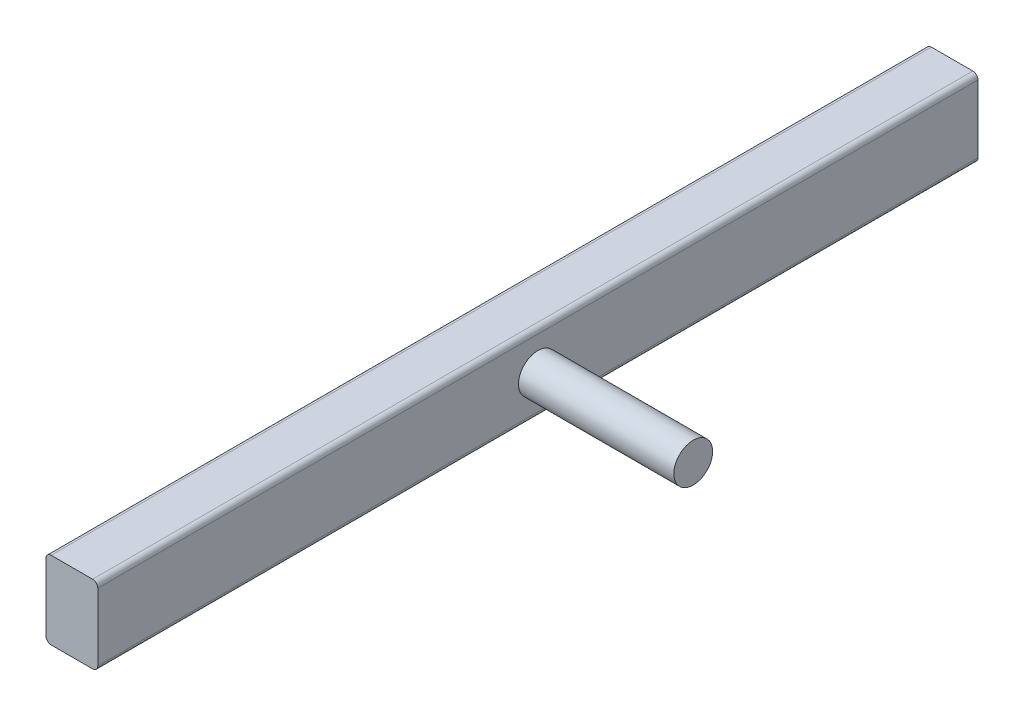
ISO-10303-21;
HEADER;
FILE_DESCRIPTION(('STEP AP214'),'2;1');
FILE_NAME('part.step','',(''),(''),'','','');
FILE_SCHEMA(('AUTOMOTIVE_DESIGN { 1 0 10303 214 1 1 1 1 }'));
ENDSEC;
DATA;
#1=APPLICATION_CONTEXT('core data for automotive mechanical design processes');
#2=APPLICATION_PROTOCOL_DEFINITION('international standard','automotive_design',2000,#1);
#3=PRODUCT_CONTEXT('',#1,'mechanical');
#4=PRODUCT('Part','Part','',(#3));
#5=PRODUCT_RELATED_PRODUCT_CATEGORY('part','',(#4));
#6=PRODUCT_DEFINITION_FORMATION('','',#4);
#7=PRODUCT_DEFINITION_CONTEXT('part definition',#1,'design');
#8=PRODUCT_DEFINITION('design','',#6,#7);
#9=PRODUCT_DEFINITION_SHAPE('','',#8);
#10=(LENGTH_UNIT() NAMED_UNIT(*) SI_UNIT(.MILLI.,.METRE.));
#11=(NAMED_UNIT(*) PLANE_ANGLE_UNIT() SI_UNIT($,.RADIAN.));
#12=(NAMED_UNIT(*) SI_UNIT($,.STERADIAN.) SOLID_ANGLE_UNIT());
#13=UNCERTAINTY_MEASURE_WITH_UNIT(LENGTH_MEASURE(1.E-05),#10,'distance_accuracy_value','');
#14=(GEOMETRIC_REPRESENTATION_CONTEXT(3) GLOBAL_UNCERTAINTY_ASSIGNED_CONTEXT((#13)) GLOBAL_UNIT_ASSIGNED_CONTEXT((#10,
#11,#12)) REPRESENTATION_CONTEXT('',''));
#15=CARTESIAN_POINT('',(0.,0.,0.));
#16=DIRECTION('',(0.,0.,1.));
#17=DIRECTION('',(1.,0.,0.));
#18=AXIS2_PLACEMENT_3D('',#15,#16,#17);
#19=CARTESIAN_POINT('',(5.,7.5,85.));
#20=DIRECTION('',(-1.,0.,0.));
#21=DIRECTION('',(0.,-1.,0.));
#22=AXIS2_PLACEMENT_3D('',#19,#20,#21);
#23=PLANE('',#22);
#24=DIRECTION('',(0.,1.,0.));
#25=VECTOR('',#24,1.);
#26=CARTESIAN_POINT('',(5.,7.5,85.));
#27=LINE('',#26,#25);
#28=CARTESIAN_POINT('',(5.,-6.5,85.));
#29=VERTEX_POINT('',#28);
#30=CARTESIAN_POINT('',(5.,6.5,85.));
#31=VERTEX_POINT('',#30);
#32=EDGE_CURVE('E163',#29,#31,#27,.T.);
#33=ORIENTED_EDGE('',*,*,#32,.F.);
#34=DIRECTION('',(0.,0.,-1.));
#35=VECTOR('',#34,1.);
#36=CARTESIAN_POINT('',(5.,-6.5,85.));
#37=LINE('',#36,#35);
#38=CARTESIAN_POINT('',(5.,-6.5,-85.));
#39=VERTEX_POINT('',#38);
#40=EDGE_CURVE('E11',#29,#39,#37,.T.);
#41=ORIENTED_EDGE('',*,*,#40,.T.);
#42=DIRECTION('',(0.,1.,0.));
#43=VECTOR('',#42,1.);
#44=CARTESIAN_POINT('',(5.,7.5,-85.));
#45=LINE('',#44,#43);
#46=CARTESIAN_POINT('',(5.,6.5,-85.));
#47=VERTEX_POINT('',#46);
#48=EDGE_CURVE('E126',#39,#47,#45,.T.);
#49=ORIENTED_EDGE('',*,*,#48,.T.);
#50=DIRECTION('',(0.,0.,-1.));
#51=VECTOR('',#50,1.);
#52=CARTESIAN_POINT('',(5.,6.5,85.));
#53=LINE('',#52,#51);
#54=EDGE_CURVE('E40',#47,#31,#53,.F.);
#55=ORIENTED_EDGE('',*,*,#54,.T.);
#56=EDGE_LOOP('',(#33,#41,#49,#55));
#57=FACE_BOUND('',#56,.T.);
#58=CARTESIAN_POINT('',(5.,0.,0.));
#59=DIRECTION('',(-1.,0.,0.));
#60=DIRECTION('',(0.,-1.,0.));
#61=AXIS2_PLACEMENT_3D('',#58,#59,#60);
#62=CIRCLE('',#61,3.75000000000001);
#63=CARTESIAN_POINT('',(5.,-3.75000000000001,0.));
#64=VERTEX_POINT('',#63);
#65=EDGE_CURVE('E138',#64,#64,#62,.F.);
#66=ORIENTED_EDGE('',*,*,#65,.F.);
#67=EDGE_LOOP('',(#66));
#68=FACE_BOUND('',#67,.T.);
#69=ADVANCED_FACE('F32',(#57,#68),#23,.F.);
#70=CARTESIAN_POINT('',(-5.,7.5,85.));
#71=DIRECTION('',(1.,0.,0.));
#72=DIRECTION('',(0.,0.,-1.));
#73=AXIS2_PLACEMENT_3D('',#70,#71,#72);
#74=PLANE('',#73);
#75=DIRECTION('',(0.,-1.,0.));
#76=VECTOR('',#75,1.);
#77=CARTESIAN_POINT('',(-5.,7.5,-85.));
#78=LINE('',#77,#76);
#79=CARTESIAN_POINT('',(-5.,6.5,-85.));
#80=VERTEX_POINT('',#79);
#81=CARTESIAN_POINT('',(-5.,-6.5,-85.));
#82=VERTEX_POINT('',#81);
#83=EDGE_CURVE('E127',#80,#82,#78,.T.);
#84=ORIENTED_EDGE('',*,*,#83,.T.);
#85=DIRECTION('',(0.,0.,-1.));
#86=VECTOR('',#85,1.);
#87=CARTESIAN_POINT('',(-5.,-6.5,85.));
#88=LINE('',#87,#86);
#89=CARTESIAN_POINT('',(-5.,-6.5,85.));
#90=VERTEX_POINT('',#89);
#91=EDGE_CURVE('E104',#82,#90,#88,.F.);
#92=ORIENTED_EDGE('',*,*,#91,.T.);
#93=DIRECTION('',(0.,-1.,0.));
#94=VECTOR('',#93,1.);
#95=CARTESIAN_POINT('',(-5.,7.5,85.));
#96=LINE('',#95,#94);
#97=CARTESIAN_POINT('',(-5.,6.5,85.));
#98=VERTEX_POINT('',#97);
#99=EDGE_CURVE('E137',#98,#90,#96,.T.);
#100=ORIENTED_EDGE('',*,*,#99,.F.);
#101=DIRECTION('',(0.,0.,-1.));
#102=VECTOR('',#101,1.);
#103=CARTESIAN_POINT('',(-5.,6.5,85.));
#104=LINE('',#103,#102);
#105=EDGE_CURVE('E109',#98,#80,#104,.T.);
#106=ORIENTED_EDGE('',*,*,#105,.T.);
#107=EDGE_LOOP('',(#84,#92,#100,#106));
#108=FACE_BOUND('',#107,.T.);
#109=ADVANCED_FACE('F179',(#108),#74,.F.);
#110=CARTESIAN_POINT('',(-5.,-7.5,85.));
#111=DIRECTION('',(0.,1.,0.));
#112=DIRECTION('',(0.,0.,1.));
#113=AXIS2_PLACEMENT_3D('',#110,#111,#112);
#114=PLANE('',#113);
#115=DIRECTION('',(1.,0.,0.));
#116=VECTOR('',#115,1.);
#117=CARTESIAN_POINT('',(-5.,-7.5,85.));
#118=LINE('',#117,#116);
#119=CARTESIAN_POINT('',(-4.,-7.5,85.));
#120=VERTEX_POINT('',#119);
#121=CARTESIAN_POINT('',(4.,-7.5,85.));
#122=VERTEX_POINT('',#121);
#123=EDGE_CURVE('E119',#120,#122,#118,.T.);
#124=ORIENTED_EDGE('',*,*,#123,.F.);
#125=DIRECTION('',(0.,0.,-1.));
#126=VECTOR('',#125,1.);
#127=CARTESIAN_POINT('',(-4.,-7.5,85.));
#128=LINE('',#127,#126);
#129=CARTESIAN_POINT('',(-4.,-7.5,-85.));
#130=VERTEX_POINT('',#129);
#131=EDGE_CURVE('E103',#120,#130,#128,.T.);
#132=ORIENTED_EDGE('',*,*,#131,.T.);
#133=DIRECTION('',(1.,0.,0.));
#134=VECTOR('',#133,1.);
#135=CARTESIAN_POINT('',(-5.,-7.5,-85.));
#136=LINE('',#135,#134);
#137=CARTESIAN_POINT('',(4.,-7.5,-85.));
#138=VERTEX_POINT('',#137);
#139=EDGE_CURVE('E116',#130,#138,#136,.T.);
#140=ORIENTED_EDGE('',*,*,#139,.T.);
#141=DIRECTION('',(0.,0.,-1.));
#142=VECTOR('',#141,1.);
#143=CARTESIAN_POINT('',(4.,-7.5,85.));
#144=LINE('',#143,#142);
#145=EDGE_CURVE('E121',#138,#122,#144,.F.);
#146=ORIENTED_EDGE('',*,*,#145,.T.);
#147=EDGE_LOOP('',(#124,#132,#140,#146));
#148=FACE_BOUND('',#147,.T.);
#149=ADVANCED_FACE('F115',(#148),#114,.F.);
#150=CARTESIAN_POINT('',(-5.,7.5,85.));
#151=DIRECTION('',(0.,-1.,0.));
#152=DIRECTION('',(1.,0.,0.));
#153=AXIS2_PLACEMENT_3D('',#150,#151,#152);
#154=PLANE('',#153);
#155=DIRECTION('',(-1.,0.,0.));
#156=VECTOR('',#155,1.);
#157=CARTESIAN_POINT('',(-5.,7.5,-85.));
#158=LINE('',#157,#156);
#159=CARTESIAN_POINT('',(4.,7.5,-85.));
#160=VERTEX_POINT('',#159);
#161=CARTESIAN_POINT('',(-4.,7.5,-85.));
#162=VERTEX_POINT('',#161);
#163=EDGE_CURVE('E130',#160,#162,#158,.T.);
#164=ORIENTED_EDGE('',*,*,#163,.T.);
#165=DIRECTION('',(0.,0.,-1.));
#166=VECTOR('',#165,1.);
#167=CARTESIAN_POINT('',(-4.,7.5,85.));
#168=LINE('',#167,#166);
#169=CARTESIAN_POINT('',(-4.,7.5,85.));
#170=VERTEX_POINT('',#169);
#171=EDGE_CURVE('E47',#162,#170,#168,.F.);
#172=ORIENTED_EDGE('',*,*,#171,.T.);
#173=DIRECTION('',(-1.,0.,0.));
#174=VECTOR('',#173,1.);
#175=CARTESIAN_POINT('',(-5.,7.5,85.));
#176=LINE('',#175,#174);
#177=CARTESIAN_POINT('',(4.,7.5,85.));
#178=VERTEX_POINT('',#177);
#179=EDGE_CURVE('E141',#178,#170,#176,.T.);
#180=ORIENTED_EDGE('',*,*,#179,.F.);
#181=DIRECTION('',(0.,0.,-1.));
#182=VECTOR('',#181,1.);
#183=CARTESIAN_POINT('',(4.,7.5,85.));
#184=LINE('',#183,#182);
#185=EDGE_CURVE('E156',#178,#160,#184,.T.);
#186=ORIENTED_EDGE('',*,*,#185,.T.);
#187=EDGE_LOOP('',(#164,#172,#180,#186));
#188=FACE_BOUND('',#187,.T.);
#189=ADVANCED_FACE('F172',(#188),#154,.F.);
#190=CARTESIAN_POINT('',(-5.,-7.5,85.));
#191=DIRECTION('',(0.,0.,1.));
#192=DIRECTION('',(1.,0.,0.));
#193=AXIS2_PLACEMENT_3D('',#190,#191,#192);
#194=PLANE('',#193);
#195=ORIENTED_EDGE('',*,*,#99,.T.);
#196=CARTESIAN_POINT('',(-4.,-6.5,85.));
#197=DIRECTION('',(0.,0.,1.));
#198=DIRECTION('',(1.,0.,0.));
#199=AXIS2_PLACEMENT_3D('',#196,#197,#198);
#200=CIRCLE('',#199,1.);
#201=EDGE_CURVE('E154',#90,#120,#200,.T.);
#202=ORIENTED_EDGE('',*,*,#201,.T.);
#203=ORIENTED_EDGE('',*,*,#123,.T.);
#204=CARTESIAN_POINT('',(4.,-6.5,85.));
#205=DIRECTION('',(0.,0.,1.));
#206=DIRECTION('',(1.,0.,0.));
#207=AXIS2_PLACEMENT_3D('',#204,#205,#206);
#208=CIRCLE('',#207,1.);
#209=EDGE_CURVE('E150',#122,#29,#208,.T.);
#210=ORIENTED_EDGE('',*,*,#209,.T.);
#211=ORIENTED_EDGE('',*,*,#32,.T.);
#212=CARTESIAN_POINT('',(4.,6.5,85.));
#213=DIRECTION('',(0.,0.,1.));
#214=DIRECTION('',(1.,0.,0.));
#215=AXIS2_PLACEMENT_3D('',#212,#213,#214);
#216=CIRCLE('',#215,1.);
#217=EDGE_CURVE('E54',#31,#178,#216,.T.);
#218=ORIENTED_EDGE('',*,*,#217,.T.);
#219=ORIENTED_EDGE('',*,*,#179,.T.);
#220=CARTESIAN_POINT('',(-4.,6.5,85.));
#221=DIRECTION('',(0.,0.,1.));
#222=DIRECTION('',(1.,0.,0.));
#223=AXIS2_PLACEMENT_3D('',#220,#221,#222);
#224=CIRCLE('',#223,1.);
#225=EDGE_CURVE('E152',#170,#98,#224,.T.);
#226=ORIENTED_EDGE('',*,*,#225,.T.);
#227=EDGE_LOOP('',(#195,#202,#203,#210,#211,#218,#219,#226));
#228=FACE_BOUND('',#227,.T.);
#229=ADVANCED_FACE('F167',(#228),#194,.T.);
#230=CARTESIAN_POINT('',(-5.,-7.5,-85.));
#231=DIRECTION('',(0.,0.,1.));
#232=DIRECTION('',(1.,0.,0.));
#233=AXIS2_PLACEMENT_3D('',#230,#231,#232);
#234=PLANE('',#233);
#235=ORIENTED_EDGE('',*,*,#139,.F.);
#236=CARTESIAN_POINT('',(-4.,-6.5,-85.));
#237=DIRECTION('',(0.,0.,1.));
#238=DIRECTION('',(1.,0.,0.));
#239=AXIS2_PLACEMENT_3D('',#236,#237,#238);
#240=CIRCLE('',#239,1.);
#241=EDGE_CURVE('E99',#130,#82,#240,.F.);
#242=ORIENTED_EDGE('',*,*,#241,.T.);
#243=ORIENTED_EDGE('',*,*,#83,.F.);
#244=CARTESIAN_POINT('',(-4.,6.5,-85.));
#245=DIRECTION('',(0.,0.,1.));
#246=DIRECTION('',(1.,0.,0.));
#247=AXIS2_PLACEMENT_3D('',#244,#245,#246);
#248=CIRCLE('',#247,1.);
#249=EDGE_CURVE('E110',#80,#162,#248,.F.);
#250=ORIENTED_EDGE('',*,*,#249,.T.);
#251=ORIENTED_EDGE('',*,*,#163,.F.);
#252=CARTESIAN_POINT('',(4.,6.5,-85.));
#253=DIRECTION('',(0.,0.,1.));
#254=DIRECTION('',(1.,0.,0.));
#255=AXIS2_PLACEMENT_3D('',#252,#253,#254);
#256=CIRCLE('',#255,1.);
#257=EDGE_CURVE('E120',#160,#47,#256,.F.);
#258=ORIENTED_EDGE('',*,*,#257,.T.);
#259=ORIENTED_EDGE('',*,*,#48,.F.);
#260=CARTESIAN_POINT('',(4.,-6.5,-85.));
#261=DIRECTION('',(0.,0.,1.));
#262=DIRECTION('',(1.,0.,0.));
#263=AXIS2_PLACEMENT_3D('',#260,#261,#262);
#264=CIRCLE('',#263,1.);
#265=EDGE_CURVE('E125',#39,#138,#264,.F.);
#266=ORIENTED_EDGE('',*,*,#265,.T.);
#267=EDGE_LOOP('',(#235,#242,#243,#250,#251,#258,#259,#266));
#268=FACE_BOUND('',#267,.T.);
#269=ADVANCED_FACE('F123',(#268),#234,.F.);
#270=CARTESIAN_POINT('',(35.,0.,0.));
#271=DIRECTION('',(-1.,0.,0.));
#272=DIRECTION('',(0.,-1.,0.));
#273=AXIS2_PLACEMENT_3D('',#270,#271,#272);
#274=CYLINDRICAL_SURFACE('',#273,3.75000000000001);
#275=CARTESIAN_POINT('',(35.,0.,0.));
#276=DIRECTION('',(1.,0.,0.));
#277=DIRECTION('',(0.,1.,0.));
#278=AXIS2_PLACEMENT_3D('',#275,#276,#277);
#279=CIRCLE('',#278,3.75000000000001);
#280=CARTESIAN_POINT('',(35.,3.75,0.));
#281=VERTEX_POINT('',#280);
#282=EDGE_CURVE('E132',#281,#281,#279,.T.);
#283=ORIENTED_EDGE('',*,*,#282,.F.);
#284=EDGE_LOOP('',(#283));
#285=FACE_BOUND('',#284,.T.);
#286=ORIENTED_EDGE('',*,*,#65,.T.);
#287=EDGE_LOOP('',(#286));
#288=FACE_BOUND('',#287,.T.);
#289=ADVANCED_FACE('F188',(#285,#288),#274,.T.);
#290=CARTESIAN_POINT('',(35.,0.,0.));
#291=DIRECTION('',(1.,0.,0.));
#292=DIRECTION('',(0.,1.,0.));
#293=AXIS2_PLACEMENT_3D('',#290,#291,#292);
#294=PLANE('',#293);
#295=ORIENTED_EDGE('',*,*,#282,.T.);
#296=EDGE_LOOP('',(#295));
#297=FACE_BOUND('',#296,.T.);
#298=ADVANCED_FACE('F186',(#297),#294,.T.);
#299=CARTESIAN_POINT('',(-4.,-6.5,85.));
#300=DIRECTION('',(0.,0.,-1.));
#301=DIRECTION('',(-1.,0.,0.));
#302=AXIS2_PLACEMENT_3D('',#299,#300,#301);
#303=CYLINDRICAL_SURFACE('',#302,1.);
#304=ORIENTED_EDGE('',*,*,#201,.F.);
#305=ORIENTED_EDGE('',*,*,#91,.F.);
#306=ORIENTED_EDGE('',*,*,#241,.F.);
#307=ORIENTED_EDGE('',*,*,#131,.F.);
#308=EDGE_LOOP('',(#304,#305,#306,#307));
#309=FACE_BOUND('',#308,.T.);
#310=ADVANCED_FACE('F102',(#309),#303,.T.);
#311=CARTESIAN_POINT('',(-4.,6.5,85.));
#312=DIRECTION('',(0.,0.,-1.));
#313=DIRECTION('',(-1.,0.,0.));
#314=AXIS2_PLACEMENT_3D('',#311,#312,#313);
#315=CYLINDRICAL_SURFACE('',#314,1.);
#316=ORIENTED_EDGE('',*,*,#225,.F.);
#317=ORIENTED_EDGE('',*,*,#171,.F.);
#318=ORIENTED_EDGE('',*,*,#249,.F.);
#319=ORIENTED_EDGE('',*,*,#105,.F.);
#320=EDGE_LOOP('',(#316,#317,#318,#319));
#321=FACE_BOUND('',#320,.T.);
#322=ADVANCED_FACE('F176',(#321),#315,.T.);
#323=CARTESIAN_POINT('',(4.,-6.5,85.));
#324=DIRECTION('',(0.,0.,-1.));
#325=DIRECTION('',(-1.,0.,0.));
#326=AXIS2_PLACEMENT_3D('',#323,#324,#325);
#327=CYLINDRICAL_SURFACE('',#326,1.);
#328=ORIENTED_EDGE('',*,*,#209,.F.);
#329=ORIENTED_EDGE('',*,*,#145,.F.);
#330=ORIENTED_EDGE('',*,*,#265,.F.);
#331=ORIENTED_EDGE('',*,*,#40,.F.);
#332=EDGE_LOOP('',(#328,#329,#330,#331));
#333=FACE_BOUND('',#332,.T.);
#334=ADVANCED_FACE('F207',(#333),#327,.T.);
#335=CARTESIAN_POINT('',(4.,6.5,85.));
#336=DIRECTION('',(0.,0.,-1.));
#337=DIRECTION('',(-1.,0.,0.));
#338=AXIS2_PLACEMENT_3D('',#335,#336,#337);
#339=CYLINDRICAL_SURFACE('',#338,1.);
#340=ORIENTED_EDGE('',*,*,#217,.F.);
#341=ORIENTED_EDGE('',*,*,#54,.F.);
#342=ORIENTED_EDGE('',*,*,#257,.F.);
#343=ORIENTED_EDGE('',*,*,#185,.F.);
#344=EDGE_LOOP('',(#340,#341,#342,#343));
#345=FACE_BOUND('',#344,.T.);
#346=ADVANCED_FACE('F34',(#345),#339,.T.);
#347=CLOSED_SHELL('',(#69,#109,#149,#189,#229,#269,#289,#298,#310,#322,#334,#346));
#348=MANIFOLD_SOLID_BREP('B2',#347);
#349=ADVANCED_BREP_SHAPE_REPRESENTATION('',(#18,#348),#14);
#350=SHAPE_DEFINITION_REPRESENTATION(#9,#349);
ENDSEC;
END-ISO-10303-21;
